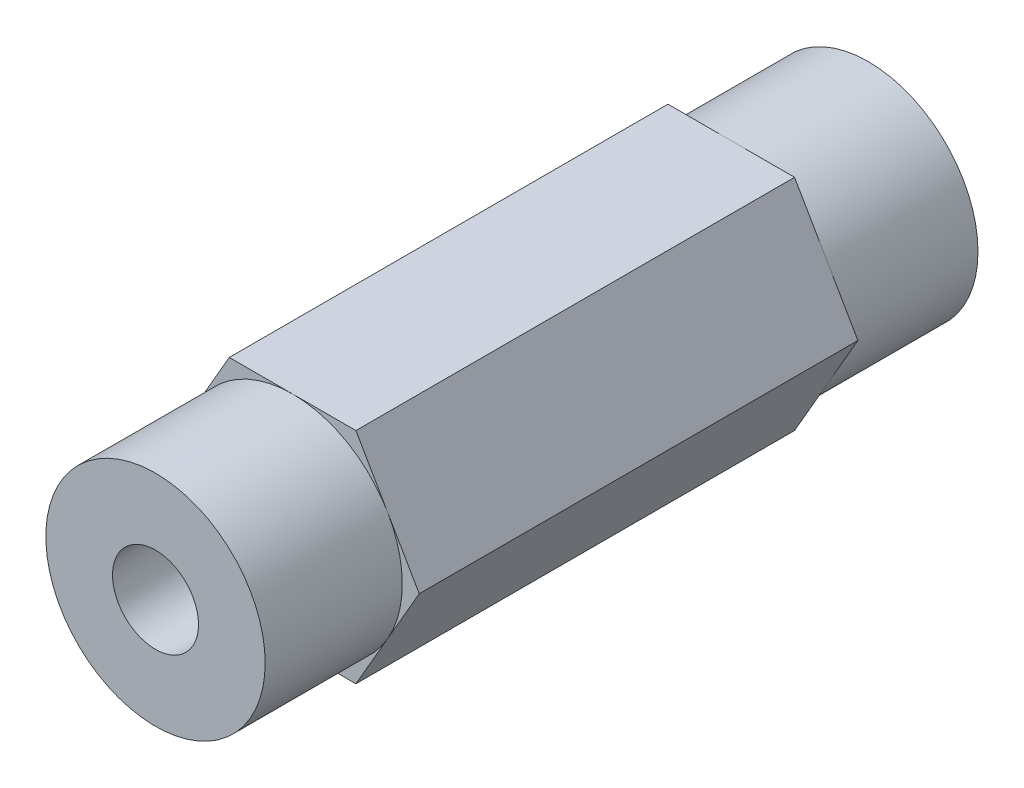
ISO-10303-21;
HEADER;
FILE_DESCRIPTION(('STEP AP214'),'2;1');
FILE_NAME('part.step','',(''),(''),'','','');
FILE_SCHEMA(('AUTOMOTIVE_DESIGN { 1 0 10303 214 1 1 1 1 }'));
ENDSEC;
DATA;
#1=APPLICATION_CONTEXT('core data for automotive mechanical design processes');
#2=APPLICATION_PROTOCOL_DEFINITION('international standard','automotive_design',2000,#1);
#3=PRODUCT_CONTEXT('',#1,'mechanical');
#4=PRODUCT('Part','Part','',(#3));
#5=PRODUCT_RELATED_PRODUCT_CATEGORY('part','',(#4));
#6=PRODUCT_DEFINITION_FORMATION('','',#4);
#7=PRODUCT_DEFINITION_CONTEXT('part definition',#1,'design');
#8=PRODUCT_DEFINITION('design','',#6,#7);
#9=PRODUCT_DEFINITION_SHAPE('','',#8);
#10=(LENGTH_UNIT() NAMED_UNIT(*) SI_UNIT(.MILLI.,.METRE.));
#11=(NAMED_UNIT(*) PLANE_ANGLE_UNIT() SI_UNIT($,.RADIAN.));
#12=(NAMED_UNIT(*) SI_UNIT($,.STERADIAN.) SOLID_ANGLE_UNIT());
#13=UNCERTAINTY_MEASURE_WITH_UNIT(LENGTH_MEASURE(1.E-05),#10,'distance_accuracy_value','');
#14=(GEOMETRIC_REPRESENTATION_CONTEXT(3) GLOBAL_UNCERTAINTY_ASSIGNED_CONTEXT((#13)) GLOBAL_UNIT_ASSIGNED_CONTEXT((#10,
#11,#12)) REPRESENTATION_CONTEXT('',''));
#15=CARTESIAN_POINT('',(0.,0.,0.));
#16=DIRECTION('',(0.,0.,1.));
#17=DIRECTION('',(1.,0.,0.));
#18=AXIS2_PLACEMENT_3D('',#15,#16,#17);
#19=CARTESIAN_POINT('',(7.33234841870825,0.,20.6375));
#20=DIRECTION('',(-0.866025403784439,-0.5,0.));
#21=DIRECTION('',(0.5,-0.866025403784439,0.));
#22=AXIS2_PLACEMENT_3D('',#19,#20,#21);
#23=PLANE('',#22);
#24=DIRECTION('',(0.5,-0.866025403784439,0.));
#25=VECTOR('',#24,1.);
#26=CARTESIAN_POINT('',(7.33234841870825,0.,-12.7));
#27=LINE('',#26,#25);
#28=CARTESIAN_POINT('',(3.66617420935413,6.35,-12.7));
#29=VERTEX_POINT('',#28);
#30=CARTESIAN_POINT('',(5.49926131403119,3.175,-12.7));
#31=VERTEX_POINT('',#30);
#32=EDGE_CURVE('E159',#29,#31,#27,.T.);
#33=ORIENTED_EDGE('',*,*,#32,.F.);
#34=DIRECTION('',(0.,0.,-1.));
#35=VECTOR('',#34,1.);
#36=CARTESIAN_POINT('',(3.66617420935413,6.35,20.6375));
#37=LINE('',#36,#35);
#38=CARTESIAN_POINT('',(3.66617420935413,6.35,12.7));
#39=VERTEX_POINT('',#38);
#40=EDGE_CURVE('E243',#39,#29,#37,.T.);
#41=ORIENTED_EDGE('',*,*,#40,.F.);
#42=DIRECTION('',(-0.5,0.866025403784439,0.));
#43=VECTOR('',#42,1.);
#44=CARTESIAN_POINT('',(7.33234841870825,0.,12.7));
#45=LINE('',#44,#43);
#46=CARTESIAN_POINT('',(5.49926131403119,3.175,12.7));
#47=VERTEX_POINT('',#46);
#48=EDGE_CURVE('E221',#47,#39,#45,.T.);
#49=ORIENTED_EDGE('',*,*,#48,.F.);
#50=CARTESIAN_POINT('',(7.33234841870825,0.,12.7));
#51=VERTEX_POINT('',#50);
#52=EDGE_CURVE('E223',#51,#47,#45,.T.);
#53=ORIENTED_EDGE('',*,*,#52,.F.);
#54=DIRECTION('',(0.,0.,-1.));
#55=VECTOR('',#54,1.);
#56=CARTESIAN_POINT('',(7.33234841870825,0.,20.6375));
#57=LINE('',#56,#55);
#58=CARTESIAN_POINT('',(7.33234841870825,0.,-12.7));
#59=VERTEX_POINT('',#58);
#60=EDGE_CURVE('E190',#51,#59,#57,.T.);
#61=ORIENTED_EDGE('',*,*,#60,.T.);
#62=EDGE_CURVE('E171',#31,#59,#27,.T.);
#63=ORIENTED_EDGE('',*,*,#62,.F.);
#64=EDGE_LOOP('',(#33,#41,#49,#53,#61,#63));
#65=FACE_BOUND('',#64,.T.);
#66=ADVANCED_FACE('F69',(#65),#23,.F.);
#67=CARTESIAN_POINT('',(3.66617420935413,6.35,20.6375));
#68=DIRECTION('',(0.,-1.,0.));
#69=DIRECTION('',(0.,0.,-1.));
#70=AXIS2_PLACEMENT_3D('',#67,#68,#69);
#71=PLANE('',#70);
#72=DIRECTION('',(1.,0.,0.));
#73=VECTOR('',#72,1.);
#74=CARTESIAN_POINT('',(3.66617420935413,6.35,-12.7));
#75=LINE('',#74,#73);
#76=CARTESIAN_POINT('',(-3.66617420935413,6.35,-12.7));
#77=VERTEX_POINT('',#76);
#78=CARTESIAN_POINT('',(0.,6.35,-12.7));
#79=VERTEX_POINT('',#78);
#80=EDGE_CURVE('E197',#77,#79,#75,.T.);
#81=ORIENTED_EDGE('',*,*,#80,.F.);
#82=DIRECTION('',(0.,0.,-1.));
#83=VECTOR('',#82,1.);
#84=CARTESIAN_POINT('',(-3.66617420935413,6.35,20.6375));
#85=LINE('',#84,#83);
#86=CARTESIAN_POINT('',(-3.66617420935413,6.35,12.7));
#87=VERTEX_POINT('',#86);
#88=EDGE_CURVE('E240',#87,#77,#85,.T.);
#89=ORIENTED_EDGE('',*,*,#88,.F.);
#90=DIRECTION('',(-1.,0.,0.));
#91=VECTOR('',#90,1.);
#92=CARTESIAN_POINT('',(3.66617420935413,6.35,12.7));
#93=LINE('',#92,#91);
#94=CARTESIAN_POINT('',(0.,6.35,12.7));
#95=VERTEX_POINT('',#94);
#96=EDGE_CURVE('E218',#95,#87,#93,.T.);
#97=ORIENTED_EDGE('',*,*,#96,.F.);
#98=EDGE_CURVE('E220',#39,#95,#93,.T.);
#99=ORIENTED_EDGE('',*,*,#98,.F.);
#100=ORIENTED_EDGE('',*,*,#40,.T.);
#101=EDGE_CURVE('E165',#79,#29,#75,.T.);
#102=ORIENTED_EDGE('',*,*,#101,.F.);
#103=EDGE_LOOP('',(#81,#89,#97,#99,#100,#102));
#104=FACE_BOUND('',#103,.T.);
#105=ADVANCED_FACE('F271',(#104),#71,.F.);
#106=CARTESIAN_POINT('',(-3.66617420935413,6.35,20.6375));
#107=DIRECTION('',(0.866025403784439,-0.5,0.));
#108=DIRECTION('',(0.5,0.866025403784439,0.));
#109=AXIS2_PLACEMENT_3D('',#106,#107,#108);
#110=PLANE('',#109);
#111=DIRECTION('',(0.5,0.866025403784439,0.));
#112=VECTOR('',#111,1.);
#113=CARTESIAN_POINT('',(-3.66617420935413,6.35,-12.7));
#114=LINE('',#113,#112);
#115=CARTESIAN_POINT('',(-7.33234841870825,0.,-12.7));
#116=VERTEX_POINT('',#115);
#117=CARTESIAN_POINT('',(-5.49926131403119,3.175,-12.7));
#118=VERTEX_POINT('',#117);
#119=EDGE_CURVE('E200',#116,#118,#114,.T.);
#120=ORIENTED_EDGE('',*,*,#119,.F.);
#121=DIRECTION('',(0.,0.,-1.));
#122=VECTOR('',#121,1.);
#123=CARTESIAN_POINT('',(-7.33234841870825,0.,20.6375));
#124=LINE('',#123,#122);
#125=CARTESIAN_POINT('',(-7.33234841870825,0.,12.7));
#126=VERTEX_POINT('',#125);
#127=EDGE_CURVE('E237',#126,#116,#124,.T.);
#128=ORIENTED_EDGE('',*,*,#127,.F.);
#129=DIRECTION('',(-0.5,-0.866025403784439,0.));
#130=VECTOR('',#129,1.);
#131=CARTESIAN_POINT('',(-3.66617420935413,6.35,12.7));
#132=LINE('',#131,#130);
#133=CARTESIAN_POINT('',(-5.49926131403119,3.175,12.7));
#134=VERTEX_POINT('',#133);
#135=EDGE_CURVE('E215',#134,#126,#132,.T.);
#136=ORIENTED_EDGE('',*,*,#135,.F.);
#137=EDGE_CURVE('E217',#87,#134,#132,.T.);
#138=ORIENTED_EDGE('',*,*,#137,.F.);
#139=ORIENTED_EDGE('',*,*,#88,.T.);
#140=EDGE_CURVE('E198',#118,#77,#114,.T.);
#141=ORIENTED_EDGE('',*,*,#140,.F.);
#142=EDGE_LOOP('',(#120,#128,#136,#138,#139,#141));
#143=FACE_BOUND('',#142,.T.);
#144=ADVANCED_FACE('F281',(#143),#110,.F.);
#145=CARTESIAN_POINT('',(-7.33234841870825,0.,20.6375));
#146=DIRECTION('',(0.866025403784439,0.5,0.));
#147=DIRECTION('',(-0.5,0.866025403784439,0.));
#148=AXIS2_PLACEMENT_3D('',#145,#146,#147);
#149=PLANE('',#148);
#150=DIRECTION('',(-0.5,0.866025403784439,0.));
#151=VECTOR('',#150,1.);
#152=CARTESIAN_POINT('',(-7.33234841870825,0.,-12.7));
#153=LINE('',#152,#151);
#154=CARTESIAN_POINT('',(-3.66617420935412,-6.35,-12.7));
#155=VERTEX_POINT('',#154);
#156=CARTESIAN_POINT('',(-5.49926131403118,-3.175,-12.7));
#157=VERTEX_POINT('',#156);
#158=EDGE_CURVE('E193',#155,#157,#153,.T.);
#159=ORIENTED_EDGE('',*,*,#158,.F.);
#160=DIRECTION('',(0.,0.,-1.));
#161=VECTOR('',#160,1.);
#162=CARTESIAN_POINT('',(-3.66617420935412,-6.35,20.6375));
#163=LINE('',#162,#161);
#164=CARTESIAN_POINT('',(-3.66617420935412,-6.35,12.7));
#165=VERTEX_POINT('',#164);
#166=EDGE_CURVE('E234',#165,#155,#163,.T.);
#167=ORIENTED_EDGE('',*,*,#166,.F.);
#168=DIRECTION('',(0.5,-0.866025403784439,0.));
#169=VECTOR('',#168,1.);
#170=CARTESIAN_POINT('',(-7.33234841870825,0.,12.7));
#171=LINE('',#170,#169);
#172=CARTESIAN_POINT('',(-5.49926131403118,-3.175,12.7));
#173=VERTEX_POINT('',#172);
#174=EDGE_CURVE('E212',#173,#165,#171,.T.);
#175=ORIENTED_EDGE('',*,*,#174,.F.);
#176=EDGE_CURVE('E214',#126,#173,#171,.T.);
#177=ORIENTED_EDGE('',*,*,#176,.F.);
#178=ORIENTED_EDGE('',*,*,#127,.T.);
#179=EDGE_CURVE('E195',#157,#116,#153,.T.);
#180=ORIENTED_EDGE('',*,*,#179,.F.);
#181=EDGE_LOOP('',(#159,#167,#175,#177,#178,#180));
#182=FACE_BOUND('',#181,.T.);
#183=ADVANCED_FACE('F293',(#182),#149,.F.);
#184=CARTESIAN_POINT('',(-3.66617420935412,-6.35,20.6375));
#185=DIRECTION('',(0.,1.,0.));
#186=DIRECTION('',(0.,0.,1.));
#187=AXIS2_PLACEMENT_3D('',#184,#185,#186);
#188=PLANE('',#187);
#189=DIRECTION('',(-1.,0.,0.));
#190=VECTOR('',#189,1.);
#191=CARTESIAN_POINT('',(-3.66617420935412,-6.35,-12.7));
#192=LINE('',#191,#190);
#193=CARTESIAN_POINT('',(3.66617420935412,-6.35,-12.7));
#194=VERTEX_POINT('',#193);
#195=CARTESIAN_POINT('',(0.,-6.35,-12.7));
#196=VERTEX_POINT('',#195);
#197=EDGE_CURVE('E186',#194,#196,#192,.T.);
#198=ORIENTED_EDGE('',*,*,#197,.F.);
#199=DIRECTION('',(0.,0.,-1.));
#200=VECTOR('',#199,1.);
#201=CARTESIAN_POINT('',(3.66617420935412,-6.35,20.6375));
#202=LINE('',#201,#200);
#203=CARTESIAN_POINT('',(3.66617420935412,-6.35,12.7));
#204=VERTEX_POINT('',#203);
#205=EDGE_CURVE('E231',#204,#194,#202,.T.);
#206=ORIENTED_EDGE('',*,*,#205,.F.);
#207=DIRECTION('',(1.,0.,0.));
#208=VECTOR('',#207,1.);
#209=CARTESIAN_POINT('',(-3.66617420935412,-6.35,12.7));
#210=LINE('',#209,#208);
#211=CARTESIAN_POINT('',(0.,-6.35,12.7));
#212=VERTEX_POINT('',#211);
#213=EDGE_CURVE('E204',#212,#204,#210,.T.);
#214=ORIENTED_EDGE('',*,*,#213,.F.);
#215=EDGE_CURVE('E211',#165,#212,#210,.T.);
#216=ORIENTED_EDGE('',*,*,#215,.F.);
#217=ORIENTED_EDGE('',*,*,#166,.T.);
#218=EDGE_CURVE('E170',#196,#155,#192,.T.);
#219=ORIENTED_EDGE('',*,*,#218,.F.);
#220=EDGE_LOOP('',(#198,#206,#214,#216,#217,#219));
#221=FACE_BOUND('',#220,.T.);
#222=ADVANCED_FACE('F302',(#221),#188,.F.);
#223=CARTESIAN_POINT('',(3.66617420935412,-6.35,20.6375));
#224=DIRECTION('',(-0.866025403784439,0.5,0.));
#225=DIRECTION('',(-0.5,-0.866025403784439,0.));
#226=AXIS2_PLACEMENT_3D('',#223,#224,#225);
#227=PLANE('',#226);
#228=DIRECTION('',(-0.5,-0.866025403784439,0.));
#229=VECTOR('',#228,1.);
#230=CARTESIAN_POINT('',(3.66617420935412,-6.35,-12.7));
#231=LINE('',#230,#229);
#232=CARTESIAN_POINT('',(5.49926131403119,-3.175,-12.7));
#233=VERTEX_POINT('',#232);
#234=EDGE_CURVE('E13',#59,#233,#231,.T.);
#235=ORIENTED_EDGE('',*,*,#234,.F.);
#236=ORIENTED_EDGE('',*,*,#60,.F.);
#237=DIRECTION('',(0.5,0.866025403784439,0.));
#238=VECTOR('',#237,1.);
#239=CARTESIAN_POINT('',(3.66617420935412,-6.35,12.7));
#240=LINE('',#239,#238);
#241=CARTESIAN_POINT('',(5.49926131403119,-3.175,12.7));
#242=VERTEX_POINT('',#241);
#243=EDGE_CURVE('E245',#242,#51,#240,.T.);
#244=ORIENTED_EDGE('',*,*,#243,.F.);
#245=EDGE_CURVE('E246',#204,#242,#240,.T.);
#246=ORIENTED_EDGE('',*,*,#245,.F.);
#247=ORIENTED_EDGE('',*,*,#205,.T.);
#248=EDGE_CURVE('E72',#233,#194,#231,.T.);
#249=ORIENTED_EDGE('',*,*,#248,.F.);
#250=EDGE_LOOP('',(#235,#236,#244,#246,#247,#249));
#251=FACE_BOUND('',#250,.T.);
#252=ADVANCED_FACE('F259',(#251),#227,.F.);
#253=CARTESIAN_POINT('',(0.,0.,-20.6375));
#254=DIRECTION('',(0.,0.,1.));
#255=DIRECTION('',(1.,0.,0.));
#256=AXIS2_PLACEMENT_3D('',#253,#254,#255);
#257=PLANE('',#256);
#258=CARTESIAN_POINT('',(0.,0.,-20.6375));
#259=DIRECTION('',(0.,0.,1.));
#260=DIRECTION('',(1.,0.,0.));
#261=AXIS2_PLACEMENT_3D('',#258,#259,#260);
#262=CIRCLE('',#261,2.4892);
#263=CARTESIAN_POINT('',(2.4892,0.,-20.6375));
#264=VERTEX_POINT('',#263);
#265=EDGE_CURVE('E227',#264,#264,#262,.T.);
#266=ORIENTED_EDGE('',*,*,#265,.T.);
#267=EDGE_LOOP('',(#266));
#268=FACE_BOUND('',#267,.T.);
#269=CARTESIAN_POINT('',(0.,0.,-20.6375));
#270=DIRECTION('',(0.,0.,1.));
#271=DIRECTION('',(1.,0.,0.));
#272=AXIS2_PLACEMENT_3D('',#269,#270,#271);
#273=CIRCLE('',#272,6.35);
#274=CARTESIAN_POINT('',(6.35,0.,-20.6375));
#275=VERTEX_POINT('',#274);
#276=EDGE_CURVE('E247',#275,#275,#273,.F.);
#277=ORIENTED_EDGE('',*,*,#276,.T.);
#278=EDGE_LOOP('',(#277));
#279=FACE_BOUND('',#278,.T.);
#280=ADVANCED_FACE('F342',(#268,#279),#257,.F.);
#281=CARTESIAN_POINT('',(0.,0.,20.6375));
#282=DIRECTION('',(0.,0.,1.));
#283=DIRECTION('',(1.,0.,0.));
#284=AXIS2_PLACEMENT_3D('',#281,#282,#283);
#285=PLANE('',#284);
#286=CARTESIAN_POINT('',(0.,0.,20.6375));
#287=DIRECTION('',(0.,0.,1.));
#288=DIRECTION('',(1.,0.,0.));
#289=AXIS2_PLACEMENT_3D('',#286,#287,#288);
#290=CIRCLE('',#289,2.4892);
#291=CARTESIAN_POINT('',(2.4892,0.,20.6375));
#292=VERTEX_POINT('',#291);
#293=EDGE_CURVE('E224',#292,#292,#290,.T.);
#294=ORIENTED_EDGE('',*,*,#293,.F.);
#295=EDGE_LOOP('',(#294));
#296=FACE_BOUND('',#295,.T.);
#297=CARTESIAN_POINT('',(0.,0.,20.6375));
#298=DIRECTION('',(0.,0.,1.));
#299=DIRECTION('',(1.,0.,0.));
#300=AXIS2_PLACEMENT_3D('',#297,#298,#299);
#301=CIRCLE('',#300,6.35);
#302=CARTESIAN_POINT('',(6.35,0.,20.6375));
#303=VERTEX_POINT('',#302);
#304=EDGE_CURVE('E201',#303,#303,#301,.T.);
#305=ORIENTED_EDGE('',*,*,#304,.T.);
#306=EDGE_LOOP('',(#305));
#307=FACE_BOUND('',#306,.T.);
#308=ADVANCED_FACE('F345',(#296,#307),#285,.T.);
#309=CARTESIAN_POINT('',(0.,0.,20.6375));
#310=DIRECTION('',(0.,0.,-1.));
#311=DIRECTION('',(-1.,0.,0.));
#312=AXIS2_PLACEMENT_3D('',#309,#310,#311);
#313=CYLINDRICAL_SURFACE('',#312,2.4892);
#314=ORIENTED_EDGE('',*,*,#293,.T.);
#315=EDGE_LOOP('',(#314));
#316=FACE_BOUND('',#315,.T.);
#317=ORIENTED_EDGE('',*,*,#265,.F.);
#318=EDGE_LOOP('',(#317));
#319=FACE_BOUND('',#318,.T.);
#320=ADVANCED_FACE('F349',(#316,#319),#313,.F.);
#321=CARTESIAN_POINT('',(0.,0.,12.7));
#322=DIRECTION('',(0.,0.,1.));
#323=DIRECTION('',(1.,0.,0.));
#324=AXIS2_PLACEMENT_3D('',#321,#322,#323);
#325=PLANE('',#324);
#326=ORIENTED_EDGE('',*,*,#52,.T.);
#327=CARTESIAN_POINT('',(0.,0.,12.7));
#328=DIRECTION('',(0.,0.,1.));
#329=DIRECTION('',(1.,0.,0.));
#330=AXIS2_PLACEMENT_3D('',#327,#328,#329);
#331=CIRCLE('',#330,6.35);
#332=EDGE_CURVE('E209',#242,#47,#331,.T.);
#333=ORIENTED_EDGE('',*,*,#332,.F.);
#334=ORIENTED_EDGE('',*,*,#243,.T.);
#335=EDGE_LOOP('',(#326,#333,#334));
#336=FACE_BOUND('',#335,.T.);
#337=ADVANCED_FACE('F261',(#336),#325,.T.);
#338=ORIENTED_EDGE('',*,*,#48,.T.);
#339=ORIENTED_EDGE('',*,*,#98,.T.);
#340=EDGE_CURVE('E205',#47,#95,#331,.T.);
#341=ORIENTED_EDGE('',*,*,#340,.F.);
#342=EDGE_LOOP('',(#338,#339,#341));
#343=FACE_BOUND('',#342,.T.);
#344=ADVANCED_FACE('F266',(#343),#325,.T.);
#345=ORIENTED_EDGE('',*,*,#96,.T.);
#346=ORIENTED_EDGE('',*,*,#137,.T.);
#347=EDGE_CURVE('E208',#95,#134,#331,.T.);
#348=ORIENTED_EDGE('',*,*,#347,.F.);
#349=EDGE_LOOP('',(#345,#346,#348));
#350=FACE_BOUND('',#349,.T.);
#351=ADVANCED_FACE('F275',(#350),#325,.T.);
#352=ORIENTED_EDGE('',*,*,#135,.T.);
#353=ORIENTED_EDGE('',*,*,#176,.T.);
#354=EDGE_CURVE('E289',#134,#173,#331,.T.);
#355=ORIENTED_EDGE('',*,*,#354,.F.);
#356=EDGE_LOOP('',(#352,#353,#355));
#357=FACE_BOUND('',#356,.T.);
#358=ADVANCED_FACE('F286',(#357),#325,.T.);
#359=ORIENTED_EDGE('',*,*,#174,.T.);
#360=ORIENTED_EDGE('',*,*,#215,.T.);
#361=EDGE_CURVE('E299',#173,#212,#331,.T.);
#362=ORIENTED_EDGE('',*,*,#361,.F.);
#363=EDGE_LOOP('',(#359,#360,#362));
#364=FACE_BOUND('',#363,.T.);
#365=ADVANCED_FACE('F298',(#364),#325,.T.);
#366=ORIENTED_EDGE('',*,*,#213,.T.);
#367=ORIENTED_EDGE('',*,*,#245,.T.);
#368=EDGE_CURVE('E91',#212,#242,#331,.T.);
#369=ORIENTED_EDGE('',*,*,#368,.F.);
#370=EDGE_LOOP('',(#366,#367,#369));
#371=FACE_BOUND('',#370,.T.);
#372=ADVANCED_FACE('F255',(#371),#325,.T.);
#373=CARTESIAN_POINT('',(0.,0.,12.7));
#374=DIRECTION('',(0.,0.,1.));
#375=DIRECTION('',(1.,0.,0.));
#376=AXIS2_PLACEMENT_3D('',#373,#374,#375);
#377=CYLINDRICAL_SURFACE('',#376,6.35);
#378=ORIENTED_EDGE('',*,*,#304,.F.);
#379=EDGE_LOOP('',(#378));
#380=FACE_BOUND('',#379,.T.);
#381=ORIENTED_EDGE('',*,*,#332,.T.);
#382=ORIENTED_EDGE('',*,*,#340,.T.);
#383=ORIENTED_EDGE('',*,*,#347,.T.);
#384=ORIENTED_EDGE('',*,*,#354,.T.);
#385=ORIENTED_EDGE('',*,*,#361,.T.);
#386=ORIENTED_EDGE('',*,*,#368,.T.);
#387=EDGE_LOOP('',(#381,#382,#383,#384,#385,#386));
#388=FACE_BOUND('',#387,.T.);
#389=ADVANCED_FACE('F315',(#380,#388),#377,.T.);
#390=CARTESIAN_POINT('',(0.,0.,-12.7));
#391=DIRECTION('',(0.,0.,-1.));
#392=DIRECTION('',(-1.,0.,0.));
#393=AXIS2_PLACEMENT_3D('',#390,#391,#392);
#394=PLANE('',#393);
#395=ORIENTED_EDGE('',*,*,#119,.T.);
#396=CARTESIAN_POINT('',(0.,0.,-12.7));
#397=DIRECTION('',(0.,0.,1.));
#398=DIRECTION('',(1.,0.,0.));
#399=AXIS2_PLACEMENT_3D('',#396,#397,#398);
#400=CIRCLE('',#399,6.35);
#401=EDGE_CURVE('E311',#118,#157,#400,.T.);
#402=ORIENTED_EDGE('',*,*,#401,.T.);
#403=ORIENTED_EDGE('',*,*,#179,.T.);
#404=EDGE_LOOP('',(#395,#402,#403));
#405=FACE_BOUND('',#404,.T.);
#406=ADVANCED_FACE('F317',(#405),#394,.T.);
#407=ORIENTED_EDGE('',*,*,#140,.T.);
#408=ORIENTED_EDGE('',*,*,#80,.T.);
#409=EDGE_CURVE('E185',#79,#118,#400,.T.);
#410=ORIENTED_EDGE('',*,*,#409,.T.);
#411=EDGE_LOOP('',(#407,#408,#410));
#412=FACE_BOUND('',#411,.T.);
#413=ADVANCED_FACE('F314',(#412),#394,.T.);
#414=ORIENTED_EDGE('',*,*,#101,.T.);
#415=ORIENTED_EDGE('',*,*,#32,.T.);
#416=EDGE_CURVE('E163',#31,#79,#400,.T.);
#417=ORIENTED_EDGE('',*,*,#416,.T.);
#418=EDGE_LOOP('',(#414,#415,#417));
#419=FACE_BOUND('',#418,.T.);
#420=ADVANCED_FACE('F161',(#419),#394,.T.);
#421=ORIENTED_EDGE('',*,*,#158,.T.);
#422=EDGE_CURVE('E307',#157,#196,#400,.T.);
#423=ORIENTED_EDGE('',*,*,#422,.T.);
#424=ORIENTED_EDGE('',*,*,#218,.T.);
#425=EDGE_LOOP('',(#421,#423,#424));
#426=FACE_BOUND('',#425,.T.);
#427=ADVANCED_FACE('F310',(#426),#394,.T.);
#428=ORIENTED_EDGE('',*,*,#62,.T.);
#429=ORIENTED_EDGE('',*,*,#234,.T.);
#430=EDGE_CURVE('E174',#233,#31,#400,.T.);
#431=ORIENTED_EDGE('',*,*,#430,.T.);
#432=EDGE_LOOP('',(#428,#429,#431));
#433=FACE_BOUND('',#432,.T.);
#434=ADVANCED_FACE('F175',(#433),#394,.T.);
#435=ORIENTED_EDGE('',*,*,#197,.T.);
#436=EDGE_CURVE('E83',#196,#233,#400,.T.);
#437=ORIENTED_EDGE('',*,*,#436,.T.);
#438=ORIENTED_EDGE('',*,*,#248,.T.);
#439=EDGE_LOOP('',(#435,#437,#438));
#440=FACE_BOUND('',#439,.T.);
#441=ADVANCED_FACE('F304',(#440),#394,.T.);
#442=CARTESIAN_POINT('',(0.,0.,-12.7));
#443=DIRECTION('',(0.,0.,-1.));
#444=DIRECTION('',(-1.,0.,0.));
#445=AXIS2_PLACEMENT_3D('',#442,#443,#444);
#446=CYLINDRICAL_SURFACE('',#445,6.35);
#447=ORIENTED_EDGE('',*,*,#416,.F.);
#448=ORIENTED_EDGE('',*,*,#430,.F.);
#449=ORIENTED_EDGE('',*,*,#436,.F.);
#450=ORIENTED_EDGE('',*,*,#422,.F.);
#451=ORIENTED_EDGE('',*,*,#401,.F.);
#452=ORIENTED_EDGE('',*,*,#409,.F.);
#453=EDGE_LOOP('',(#447,#448,#449,#450,#451,#452));
#454=FACE_BOUND('',#453,.T.);
#455=ORIENTED_EDGE('',*,*,#276,.F.);
#456=EDGE_LOOP('',(#455));
#457=FACE_BOUND('',#456,.T.);
#458=ADVANCED_FACE('F181',(#454,#457),#446,.T.);
#459=CLOSED_SHELL('',(#66,#105,#144,#183,#222,#252,#280,#308,#320,#337,#344,#351,#358,#365,#372,
#389,#406,#413,#420,#427,#434,#441,#458));
#460=MANIFOLD_SOLID_BREP('B2',#459);
#461=ADVANCED_BREP_SHAPE_REPRESENTATION('',(#18,#460),#14);
#462=SHAPE_DEFINITION_REPRESENTATION(#9,#461);
ENDSEC;
END-ISO-10303-21;
